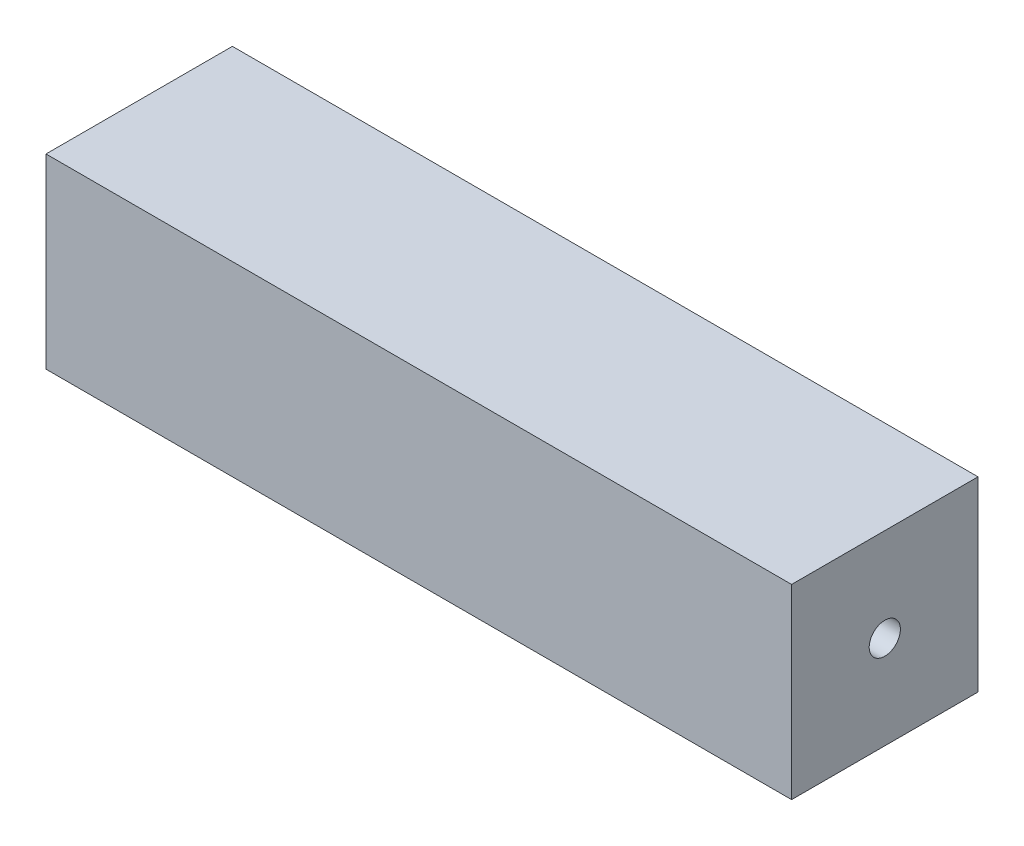
ISO-10303-21;
HEADER;
FILE_DESCRIPTION(('STEP AP214'),'2;1');
FILE_NAME('part.step','',(''),(''),'','','');
FILE_SCHEMA(('AUTOMOTIVE_DESIGN { 1 0 10303 214 1 1 1 1 }'));
ENDSEC;
DATA;
#1=APPLICATION_CONTEXT('core data for automotive mechanical design processes');
#2=APPLICATION_PROTOCOL_DEFINITION('international standard','automotive_design',2000,#1);
#3=PRODUCT_CONTEXT('',#1,'mechanical');
#4=PRODUCT('Part','Part','',(#3));
#5=PRODUCT_RELATED_PRODUCT_CATEGORY('part','',(#4));
#6=PRODUCT_DEFINITION_FORMATION('','',#4);
#7=PRODUCT_DEFINITION_CONTEXT('part definition',#1,'design');
#8=PRODUCT_DEFINITION('design','',#6,#7);
#9=PRODUCT_DEFINITION_SHAPE('','',#8);
#10=(LENGTH_UNIT() NAMED_UNIT(*) SI_UNIT(.MILLI.,.METRE.));
#11=(NAMED_UNIT(*) PLANE_ANGLE_UNIT() SI_UNIT($,.RADIAN.));
#12=(NAMED_UNIT(*) SI_UNIT($,.STERADIAN.) SOLID_ANGLE_UNIT());
#13=UNCERTAINTY_MEASURE_WITH_UNIT(LENGTH_MEASURE(1.E-05),#10,'distance_accuracy_value','');
#14=(GEOMETRIC_REPRESENTATION_CONTEXT(3) GLOBAL_UNCERTAINTY_ASSIGNED_CONTEXT((#13)) GLOBAL_UNIT_ASSIGNED_CONTEXT((#10,
#11,#12)) REPRESENTATION_CONTEXT('',''));
#15=CARTESIAN_POINT('',(0.,0.,0.));
#16=DIRECTION('',(0.,0.,1.));
#17=DIRECTION('',(1.,0.,0.));
#18=AXIS2_PLACEMENT_3D('',#15,#16,#17);
#19=CARTESIAN_POINT('',(0.,20.,0.));
#20=DIRECTION('',(1.,0.,0.));
#21=DIRECTION('',(0.,0.,-1.));
#22=AXIS2_PLACEMENT_3D('',#19,#20,#21);
#23=PLANE('',#22);
#24=DIRECTION('',(0.,0.,1.));
#25=VECTOR('',#24,1.);
#26=CARTESIAN_POINT('',(0.,0.,0.));
#27=LINE('',#26,#25);
#28=CARTESIAN_POINT('',(0.,0.,-20.));
#29=VERTEX_POINT('',#28);
#30=CARTESIAN_POINT('',(0.,0.,0.));
#31=VERTEX_POINT('',#30);
#32=EDGE_CURVE('E113',#29,#31,#27,.T.);
#33=ORIENTED_EDGE('',*,*,#32,.T.);
#34=DIRECTION('',(0.,-1.,0.));
#35=VECTOR('',#34,1.);
#36=CARTESIAN_POINT('',(0.,20.,0.));
#37=LINE('',#36,#35);
#38=CARTESIAN_POINT('',(0.,20.,0.));
#39=VERTEX_POINT('',#38);
#40=EDGE_CURVE('E11',#39,#31,#37,.T.);
#41=ORIENTED_EDGE('',*,*,#40,.F.);
#42=DIRECTION('',(0.,0.,1.));
#43=VECTOR('',#42,1.);
#44=CARTESIAN_POINT('',(0.,20.,0.));
#45=LINE('',#44,#43);
#46=CARTESIAN_POINT('',(0.,20.,-20.));
#47=VERTEX_POINT('',#46);
#48=EDGE_CURVE('E97',#47,#39,#45,.T.);
#49=ORIENTED_EDGE('',*,*,#48,.F.);
#50=DIRECTION('',(0.,-1.,0.));
#51=VECTOR('',#50,1.);
#52=CARTESIAN_POINT('',(0.,20.,-20.));
#53=LINE('',#52,#51);
#54=EDGE_CURVE('E109',#47,#29,#53,.T.);
#55=ORIENTED_EDGE('',*,*,#54,.T.);
#56=EDGE_LOOP('',(#33,#41,#49,#55));
#57=FACE_BOUND('',#56,.T.);
#58=ADVANCED_FACE('F45',(#57),#23,.F.);
#59=CARTESIAN_POINT('',(0.,20.,0.));
#60=DIRECTION('',(0.,0.,-1.));
#61=DIRECTION('',(-1.,0.,0.));
#62=AXIS2_PLACEMENT_3D('',#59,#60,#61);
#63=PLANE('',#62);
#64=DIRECTION('',(1.,0.,0.));
#65=VECTOR('',#64,1.);
#66=CARTESIAN_POINT('',(0.,0.,0.));
#67=LINE('',#66,#65);
#68=CARTESIAN_POINT('',(80.,0.,0.));
#69=VERTEX_POINT('',#68);
#70=EDGE_CURVE('E102',#31,#69,#67,.T.);
#71=ORIENTED_EDGE('',*,*,#70,.T.);
#72=DIRECTION('',(0.,-1.,0.));
#73=VECTOR('',#72,1.);
#74=CARTESIAN_POINT('',(80.,20.,0.));
#75=LINE('',#74,#73);
#76=CARTESIAN_POINT('',(80.,20.,0.));
#77=VERTEX_POINT('',#76);
#78=EDGE_CURVE('E54',#77,#69,#75,.T.);
#79=ORIENTED_EDGE('',*,*,#78,.F.);
#80=DIRECTION('',(1.,0.,0.));
#81=VECTOR('',#80,1.);
#82=CARTESIAN_POINT('',(0.,20.,0.));
#83=LINE('',#82,#81);
#84=EDGE_CURVE('E92',#39,#77,#83,.T.);
#85=ORIENTED_EDGE('',*,*,#84,.F.);
#86=ORIENTED_EDGE('',*,*,#40,.T.);
#87=EDGE_LOOP('',(#71,#79,#85,#86));
#88=FACE_BOUND('',#87,.T.);
#89=ADVANCED_FACE('F101',(#88),#63,.F.);
#90=CARTESIAN_POINT('',(80.,20.,0.));
#91=DIRECTION('',(-1.,0.,0.));
#92=DIRECTION('',(0.,0.,1.));
#93=AXIS2_PLACEMENT_3D('',#90,#91,#92);
#94=PLANE('',#93);
#95=CARTESIAN_POINT('',(80.,10.,-10.));
#96=DIRECTION('',(1.,0.,0.));
#97=DIRECTION('',(0.,0.,-1.));
#98=AXIS2_PLACEMENT_3D('',#95,#96,#97);
#99=CIRCLE('',#98,1.67266898534711);
#100=CARTESIAN_POINT('',(80.,10.,-11.6726689853471));
#101=VERTEX_POINT('',#100);
#102=EDGE_CURVE('E134',#101,#101,#99,.T.);
#103=ORIENTED_EDGE('',*,*,#102,.F.);
#104=EDGE_LOOP('',(#103));
#105=FACE_BOUND('',#104,.T.);
#106=DIRECTION('',(0.,0.,-1.));
#107=VECTOR('',#106,1.);
#108=CARTESIAN_POINT('',(80.,0.,0.));
#109=LINE('',#108,#107);
#110=CARTESIAN_POINT('',(80.,0.,-20.));
#111=VERTEX_POINT('',#110);
#112=EDGE_CURVE('E79',#69,#111,#109,.T.);
#113=ORIENTED_EDGE('',*,*,#112,.T.);
#114=DIRECTION('',(0.,-1.,0.));
#115=VECTOR('',#114,1.);
#116=CARTESIAN_POINT('',(80.,20.,-20.));
#117=LINE('',#116,#115);
#118=CARTESIAN_POINT('',(80.,20.,-20.));
#119=VERTEX_POINT('',#118);
#120=EDGE_CURVE('E104',#119,#111,#117,.T.);
#121=ORIENTED_EDGE('',*,*,#120,.F.);
#122=DIRECTION('',(0.,0.,-1.));
#123=VECTOR('',#122,1.);
#124=CARTESIAN_POINT('',(80.,20.,0.));
#125=LINE('',#124,#123);
#126=EDGE_CURVE('E95',#77,#119,#125,.T.);
#127=ORIENTED_EDGE('',*,*,#126,.F.);
#128=ORIENTED_EDGE('',*,*,#78,.T.);
#129=EDGE_LOOP('',(#113,#121,#127,#128));
#130=FACE_BOUND('',#129,.T.);
#131=ADVANCED_FACE('F105',(#105,#130),#94,.F.);
#132=CARTESIAN_POINT('',(0.,20.,-20.));
#133=DIRECTION('',(0.,0.,1.));
#134=DIRECTION('',(1.,0.,0.));
#135=AXIS2_PLACEMENT_3D('',#132,#133,#134);
#136=PLANE('',#135);
#137=DIRECTION('',(-1.,0.,0.));
#138=VECTOR('',#137,1.);
#139=CARTESIAN_POINT('',(0.,0.,-20.));
#140=LINE('',#139,#138);
#141=EDGE_CURVE('E85',#111,#29,#140,.T.);
#142=ORIENTED_EDGE('',*,*,#141,.T.);
#143=ORIENTED_EDGE('',*,*,#54,.F.);
#144=DIRECTION('',(-1.,0.,0.));
#145=VECTOR('',#144,1.);
#146=CARTESIAN_POINT('',(0.,20.,-20.));
#147=LINE('',#146,#145);
#148=EDGE_CURVE('E62',#119,#47,#147,.T.);
#149=ORIENTED_EDGE('',*,*,#148,.F.);
#150=ORIENTED_EDGE('',*,*,#120,.T.);
#151=EDGE_LOOP('',(#142,#143,#149,#150));
#152=FACE_BOUND('',#151,.T.);
#153=ADVANCED_FACE('F127',(#152),#136,.F.);
#154=CARTESIAN_POINT('',(0.,20.,0.));
#155=DIRECTION('',(0.,-1.,0.));
#156=DIRECTION('',(0.,0.,-1.));
#157=AXIS2_PLACEMENT_3D('',#154,#155,#156);
#158=PLANE('',#157);
#159=ORIENTED_EDGE('',*,*,#48,.T.);
#160=ORIENTED_EDGE('',*,*,#84,.T.);
#161=ORIENTED_EDGE('',*,*,#126,.T.);
#162=ORIENTED_EDGE('',*,*,#148,.T.);
#163=EDGE_LOOP('',(#159,#160,#161,#162));
#164=FACE_BOUND('',#163,.T.);
#165=ADVANCED_FACE('F93',(#164),#158,.F.);
#166=CARTESIAN_POINT('',(0.,0.,0.));
#167=DIRECTION('',(0.,-1.,0.));
#168=DIRECTION('',(0.,0.,-1.));
#169=AXIS2_PLACEMENT_3D('',#166,#167,#168);
#170=PLANE('',#169);
#171=ORIENTED_EDGE('',*,*,#32,.F.);
#172=ORIENTED_EDGE('',*,*,#141,.F.);
#173=ORIENTED_EDGE('',*,*,#112,.F.);
#174=ORIENTED_EDGE('',*,*,#70,.F.);
#175=EDGE_LOOP('',(#171,#172,#173,#174));
#176=FACE_BOUND('',#175,.T.);
#177=ADVANCED_FACE('F130',(#176),#170,.T.);
#178=CARTESIAN_POINT('',(60.,10.,-10.));
#179=DIRECTION('',(1.,0.,0.));
#180=DIRECTION('',(0.,0.,-1.));
#181=AXIS2_PLACEMENT_3D('',#178,#179,#180);
#182=CYLINDRICAL_SURFACE('',#181,1.67266898534711);
#183=CARTESIAN_POINT('',(60.,10.,-10.));
#184=DIRECTION('',(1.,0.,0.));
#185=DIRECTION('',(0.,0.,-1.));
#186=AXIS2_PLACEMENT_3D('',#183,#184,#185);
#187=CIRCLE('',#186,1.67266898534711);
#188=CARTESIAN_POINT('',(60.,10.,-11.6726689853471));
#189=VERTEX_POINT('',#188);
#190=EDGE_CURVE('E117',#189,#189,#187,.T.);
#191=ORIENTED_EDGE('',*,*,#190,.F.);
#192=EDGE_LOOP('',(#191));
#193=FACE_BOUND('',#192,.T.);
#194=ORIENTED_EDGE('',*,*,#102,.T.);
#195=EDGE_LOOP('',(#194));
#196=FACE_BOUND('',#195,.T.);
#197=ADVANCED_FACE('F144',(#193,#196),#182,.F.);
#198=CARTESIAN_POINT('',(60.,10.,-10.));
#199=DIRECTION('',(1.,0.,0.));
#200=DIRECTION('',(0.,0.,-1.));
#201=AXIS2_PLACEMENT_3D('',#198,#199,#200);
#202=PLANE('',#201);
#203=ORIENTED_EDGE('',*,*,#190,.T.);
#204=EDGE_LOOP('',(#203));
#205=FACE_BOUND('',#204,.T.);
#206=ADVANCED_FACE('F142',(#205),#202,.T.);
#207=CLOSED_SHELL('',(#58,#89,#131,#153,#165,#177,#197,#206));
#208=MANIFOLD_SOLID_BREP('B2',#207);
#209=ADVANCED_BREP_SHAPE_REPRESENTATION('',(#18,#208),#14);
#210=SHAPE_DEFINITION_REPRESENTATION(#9,#209);
ENDSEC;
END-ISO-10303-21;
